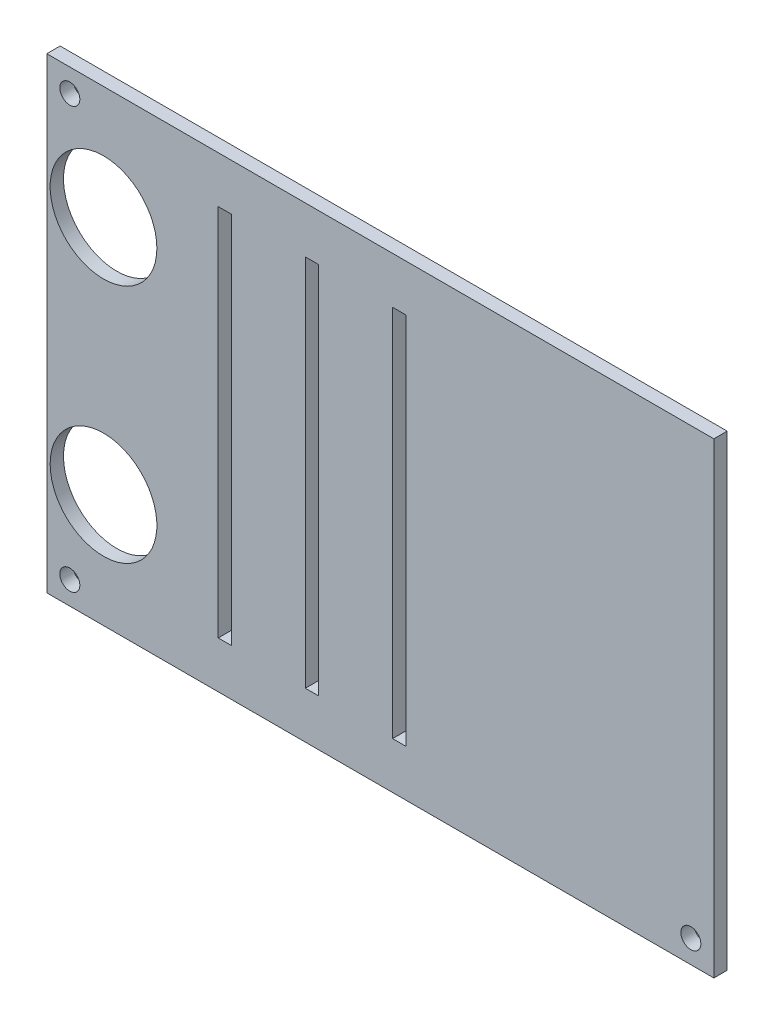
ISO-10303-21;
HEADER;
FILE_DESCRIPTION(('STEP AP214'),'2;1');
FILE_NAME('part.step','',(''),(''),'','','');
FILE_SCHEMA(('AUTOMOTIVE_DESIGN { 1 0 10303 214 1 1 1 1 }'));
ENDSEC;
DATA;
#1=APPLICATION_CONTEXT('core data for automotive mechanical design processes');
#2=APPLICATION_PROTOCOL_DEFINITION('international standard','automotive_design',2000,#1);
#3=PRODUCT_CONTEXT('',#1,'mechanical');
#4=PRODUCT('Part','Part','',(#3));
#5=PRODUCT_RELATED_PRODUCT_CATEGORY('part','',(#4));
#6=PRODUCT_DEFINITION_FORMATION('','',#4);
#7=PRODUCT_DEFINITION_CONTEXT('part definition',#1,'design');
#8=PRODUCT_DEFINITION('design','',#6,#7);
#9=PRODUCT_DEFINITION_SHAPE('','',#8);
#10=(LENGTH_UNIT() NAMED_UNIT(*) SI_UNIT(.MILLI.,.METRE.));
#11=(NAMED_UNIT(*) PLANE_ANGLE_UNIT() SI_UNIT($,.RADIAN.));
#12=(NAMED_UNIT(*) SI_UNIT($,.STERADIAN.) SOLID_ANGLE_UNIT());
#13=UNCERTAINTY_MEASURE_WITH_UNIT(LENGTH_MEASURE(1.E-05),#10,'distance_accuracy_value','');
#14=(GEOMETRIC_REPRESENTATION_CONTEXT(3) GLOBAL_UNCERTAINTY_ASSIGNED_CONTEXT((#13)) GLOBAL_UNIT_ASSIGNED_CONTEXT((#10,
#11,#12)) REPRESENTATION_CONTEXT('',''));
#15=CARTESIAN_POINT('',(0.,0.,0.));
#16=DIRECTION('',(0.,0.,1.));
#17=DIRECTION('',(1.,0.,0.));
#18=AXIS2_PLACEMENT_3D('',#15,#16,#17);
#19=CARTESIAN_POINT('',(0.,0.,2.));
#20=DIRECTION('',(0.,0.,1.));
#21=DIRECTION('',(1.,0.,0.));
#22=AXIS2_PLACEMENT_3D('',#19,#20,#21);
#23=PLANE('',#22);
#24=CARTESIAN_POINT('',(8.5,-17.,2.));
#25=DIRECTION('',(0.,0.,1.));
#26=DIRECTION('',(1.,0.,0.));
#27=AXIS2_PLACEMENT_3D('',#24,#25,#26);
#28=CIRCLE('',#27,8.);
#29=CARTESIAN_POINT('',(16.5,-17.,2.));
#30=VERTEX_POINT('',#29);
#31=EDGE_CURVE('E305',#30,#30,#28,.T.);
#32=ORIENTED_EDGE('',*,*,#31,.F.);
#33=EDGE_LOOP('',(#32));
#34=FACE_BOUND('',#33,.T.);
#35=CARTESIAN_POINT('',(3.45,-66.55,2.));
#36=DIRECTION('',(0.,0.,1.));
#37=DIRECTION('',(-1.,0.,0.));
#38=AXIS2_PLACEMENT_3D('',#35,#36,#37);
#39=CIRCLE('',#38,1.5);
#40=CARTESIAN_POINT('',(1.95,-66.55,2.));
#41=VERTEX_POINT('',#40);
#42=EDGE_CURVE('E321',#41,#41,#39,.T.);
#43=ORIENTED_EDGE('',*,*,#42,.F.);
#44=EDGE_LOOP('',(#43));
#45=FACE_BOUND('',#44,.T.);
#46=DIRECTION('',(0.,-1.,0.));
#47=VECTOR('',#46,1.);
#48=CARTESIAN_POINT('',(0.,0.,2.));
#49=LINE('',#48,#47);
#50=CARTESIAN_POINT('',(0.,0.,2.));
#51=VERTEX_POINT('',#50);
#52=CARTESIAN_POINT('',(0.,-70.,2.));
#53=VERTEX_POINT('',#52);
#54=EDGE_CURVE('E337',#51,#53,#49,.T.);
#55=ORIENTED_EDGE('',*,*,#54,.T.);
#56=DIRECTION('',(1.,0.,0.));
#57=VECTOR('',#56,1.);
#58=CARTESIAN_POINT('',(0.,-70.,2.));
#59=LINE('',#58,#57);
#60=CARTESIAN_POINT('',(100.,-70.,2.));
#61=VERTEX_POINT('',#60);
#62=EDGE_CURVE('E341',#53,#61,#59,.T.);
#63=ORIENTED_EDGE('',*,*,#62,.T.);
#64=DIRECTION('',(0.,1.,0.));
#65=VECTOR('',#64,1.);
#66=CARTESIAN_POINT('',(100.,0.,2.));
#67=LINE('',#66,#65);
#68=CARTESIAN_POINT('',(100.,0.,2.));
#69=VERTEX_POINT('',#68);
#70=EDGE_CURVE('E345',#61,#69,#67,.T.);
#71=ORIENTED_EDGE('',*,*,#70,.T.);
#72=DIRECTION('',(-1.,0.,0.));
#73=VECTOR('',#72,1.);
#74=CARTESIAN_POINT('',(0.,0.,2.));
#75=LINE('',#74,#73);
#76=EDGE_CURVE('E348',#69,#51,#75,.T.);
#77=ORIENTED_EDGE('',*,*,#76,.T.);
#78=EDGE_LOOP('',(#55,#63,#71,#77));
#79=FACE_BOUND('',#78,.T.);
#80=CARTESIAN_POINT('',(3.45,-3.45,2.));
#81=DIRECTION('',(0.,0.,1.));
#82=DIRECTION('',(1.,0.,0.));
#83=AXIS2_PLACEMENT_3D('',#80,#81,#82);
#84=CIRCLE('',#83,1.5);
#85=CARTESIAN_POINT('',(4.95,-3.45,2.));
#86=VERTEX_POINT('',#85);
#87=EDGE_CURVE('E329',#86,#86,#84,.T.);
#88=ORIENTED_EDGE('',*,*,#87,.F.);
#89=EDGE_LOOP('',(#88));
#90=FACE_BOUND('',#89,.T.);
#91=CARTESIAN_POINT('',(96.55,-66.55,2.));
#92=DIRECTION('',(0.,0.,1.));
#93=DIRECTION('',(1.,0.,0.));
#94=AXIS2_PLACEMENT_3D('',#91,#92,#93);
#95=CIRCLE('',#94,1.49999999999998);
#96=CARTESIAN_POINT('',(98.05,-66.55,2.));
#97=VERTEX_POINT('',#96);
#98=EDGE_CURVE('E313',#97,#97,#95,.T.);
#99=ORIENTED_EDGE('',*,*,#98,.F.);
#100=EDGE_LOOP('',(#99));
#101=FACE_BOUND('',#100,.T.);
#102=CARTESIAN_POINT('',(8.5,-53.,2.));
#103=DIRECTION('',(0.,0.,1.));
#104=DIRECTION('',(-1.,0.,0.));
#105=AXIS2_PLACEMENT_3D('',#102,#103,#104);
#106=CIRCLE('',#105,8.);
#107=CARTESIAN_POINT('',(0.500000000000002,-53.,2.));
#108=VERTEX_POINT('',#107);
#109=EDGE_CURVE('E297',#108,#108,#106,.T.);
#110=ORIENTED_EDGE('',*,*,#109,.F.);
#111=EDGE_LOOP('',(#110));
#112=FACE_BOUND('',#111,.T.);
#113=DIRECTION('',(-1.,0.,0.));
#114=VECTOR('',#113,1.);
#115=CARTESIAN_POINT('',(38.76,-6.99999999999996,2.));
#116=LINE('',#115,#114);
#117=CARTESIAN_POINT('',(40.76,-6.99999999999996,2.));
#118=VERTEX_POINT('',#117);
#119=CARTESIAN_POINT('',(38.76,-6.99999999999996,2.));
#120=VERTEX_POINT('',#119);
#121=EDGE_CURVE('E257',#118,#120,#116,.T.);
#122=ORIENTED_EDGE('',*,*,#121,.F.);
#123=DIRECTION('',(0.,1.,0.));
#124=VECTOR('',#123,1.);
#125=CARTESIAN_POINT('',(40.76,-63.,2.));
#126=LINE('',#125,#124);
#127=CARTESIAN_POINT('',(40.76,-63.,2.));
#128=VERTEX_POINT('',#127);
#129=EDGE_CURVE('E254',#128,#118,#126,.T.);
#130=ORIENTED_EDGE('',*,*,#129,.F.);
#131=DIRECTION('',(1.,0.,0.));
#132=VECTOR('',#131,1.);
#133=CARTESIAN_POINT('',(38.76,-63.,2.));
#134=LINE('',#133,#132);
#135=CARTESIAN_POINT('',(38.76,-63.,2.));
#136=VERTEX_POINT('',#135);
#137=EDGE_CURVE('E265',#136,#128,#134,.T.);
#138=ORIENTED_EDGE('',*,*,#137,.F.);
#139=DIRECTION('',(0.,-1.,0.));
#140=VECTOR('',#139,1.);
#141=CARTESIAN_POINT('',(38.76,-63.,2.));
#142=LINE('',#141,#140);
#143=EDGE_CURVE('E261',#120,#136,#142,.T.);
#144=ORIENTED_EDGE('',*,*,#143,.F.);
#145=EDGE_LOOP('',(#122,#130,#138,#144));
#146=FACE_BOUND('',#145,.T.);
#147=DIRECTION('',(-1.,0.,0.));
#148=VECTOR('',#147,1.);
#149=CARTESIAN_POINT('',(51.84,-6.99999999999999,2.));
#150=LINE('',#149,#148);
#151=CARTESIAN_POINT('',(53.84,-6.99999999999999,2.));
#152=VERTEX_POINT('',#151);
#153=CARTESIAN_POINT('',(51.84,-6.99999999999999,2.));
#154=VERTEX_POINT('',#153);
#155=EDGE_CURVE('E214',#152,#154,#150,.T.);
#156=ORIENTED_EDGE('',*,*,#155,.F.);
#157=DIRECTION('',(0.,1.,0.));
#158=VECTOR('',#157,1.);
#159=CARTESIAN_POINT('',(53.84,-63.,2.));
#160=LINE('',#159,#158);
#161=CARTESIAN_POINT('',(53.84,-63.,2.));
#162=VERTEX_POINT('',#161);
#163=EDGE_CURVE('E211',#162,#152,#160,.T.);
#164=ORIENTED_EDGE('',*,*,#163,.F.);
#165=DIRECTION('',(1.,0.,0.));
#166=VECTOR('',#165,1.);
#167=CARTESIAN_POINT('',(51.84,-63.,2.));
#168=LINE('',#167,#166);
#169=CARTESIAN_POINT('',(51.84,-63.,2.));
#170=VERTEX_POINT('',#169);
#171=EDGE_CURVE('E222',#170,#162,#168,.T.);
#172=ORIENTED_EDGE('',*,*,#171,.F.);
#173=DIRECTION('',(0.,-1.,0.));
#174=VECTOR('',#173,1.);
#175=CARTESIAN_POINT('',(51.84,-63.,2.));
#176=LINE('',#175,#174);
#177=EDGE_CURVE('E218',#154,#170,#176,.T.);
#178=ORIENTED_EDGE('',*,*,#177,.F.);
#179=EDGE_LOOP('',(#156,#164,#172,#178));
#180=FACE_BOUND('',#179,.T.);
#181=DIRECTION('',(0.,-1.,0.));
#182=VECTOR('',#181,1.);
#183=CARTESIAN_POINT('',(25.7,-63.0000000000001,2.));
#184=LINE('',#183,#182);
#185=CARTESIAN_POINT('',(25.7,-7.00000000000005,2.));
#186=VERTEX_POINT('',#185);
#187=CARTESIAN_POINT('',(25.7,-63.0000000000001,2.));
#188=VERTEX_POINT('',#187);
#189=EDGE_CURVE('E172',#186,#188,#184,.T.);
#190=ORIENTED_EDGE('',*,*,#189,.F.);
#191=DIRECTION('',(-1.,0.,0.));
#192=VECTOR('',#191,1.);
#193=CARTESIAN_POINT('',(25.7,-7.00000000000005,2.));
#194=LINE('',#193,#192);
#195=CARTESIAN_POINT('',(27.7,-7.00000000000005,2.));
#196=VERTEX_POINT('',#195);
#197=EDGE_CURVE('E163',#196,#186,#194,.T.);
#198=ORIENTED_EDGE('',*,*,#197,.F.);
#199=DIRECTION('',(0.,1.,0.));
#200=VECTOR('',#199,1.);
#201=CARTESIAN_POINT('',(27.7,-63.0000000000001,2.));
#202=LINE('',#201,#200);
#203=CARTESIAN_POINT('',(27.7,-63.0000000000001,2.));
#204=VERTEX_POINT('',#203);
#205=EDGE_CURVE('E189',#204,#196,#202,.T.);
#206=ORIENTED_EDGE('',*,*,#205,.F.);
#207=DIRECTION('',(1.,0.,0.));
#208=VECTOR('',#207,1.);
#209=CARTESIAN_POINT('',(25.7,-63.0000000000001,2.));
#210=LINE('',#209,#208);
#211=EDGE_CURVE('E185',#188,#204,#210,.T.);
#212=ORIENTED_EDGE('',*,*,#211,.F.);
#213=EDGE_LOOP('',(#190,#198,#206,#212));
#214=FACE_BOUND('',#213,.T.);
#215=ADVANCED_FACE('F49',(#34,#45,#79,#90,#101,#112,#146,#180,#214),#23,.T.);
#216=CARTESIAN_POINT('',(0.,0.,0.));
#217=DIRECTION('',(0.,0.,1.));
#218=DIRECTION('',(1.,0.,0.));
#219=AXIS2_PLACEMENT_3D('',#216,#217,#218);
#220=PLANE('',#219);
#221=DIRECTION('',(0.,1.,0.));
#222=VECTOR('',#221,1.);
#223=CARTESIAN_POINT('',(53.84,-63.,0.));
#224=LINE('',#223,#222);
#225=CARTESIAN_POINT('',(53.84,-63.,0.));
#226=VERTEX_POINT('',#225);
#227=CARTESIAN_POINT('',(53.84,-6.99999999999999,0.));
#228=VERTEX_POINT('',#227);
#229=EDGE_CURVE('E181',#226,#228,#224,.T.);
#230=ORIENTED_EDGE('',*,*,#229,.T.);
#231=DIRECTION('',(-1.,0.,0.));
#232=VECTOR('',#231,1.);
#233=CARTESIAN_POINT('',(51.84,-6.99999999999999,0.));
#234=LINE('',#233,#232);
#235=CARTESIAN_POINT('',(51.84,-6.99999999999999,0.));
#236=VERTEX_POINT('',#235);
#237=EDGE_CURVE('E229',#228,#236,#234,.T.);
#238=ORIENTED_EDGE('',*,*,#237,.T.);
#239=DIRECTION('',(0.,-1.,0.));
#240=VECTOR('',#239,1.);
#241=CARTESIAN_POINT('',(51.84,-63.,0.));
#242=LINE('',#241,#240);
#243=CARTESIAN_POINT('',(51.84,-63.,0.));
#244=VERTEX_POINT('',#243);
#245=EDGE_CURVE('E233',#236,#244,#242,.T.);
#246=ORIENTED_EDGE('',*,*,#245,.T.);
#247=DIRECTION('',(1.,0.,0.));
#248=VECTOR('',#247,1.);
#249=CARTESIAN_POINT('',(51.84,-63.,0.));
#250=LINE('',#249,#248);
#251=EDGE_CURVE('E215',#244,#226,#250,.T.);
#252=ORIENTED_EDGE('',*,*,#251,.T.);
#253=EDGE_LOOP('',(#230,#238,#246,#252));
#254=FACE_BOUND('',#253,.T.);
#255=CARTESIAN_POINT('',(8.5,-53.,0.));
#256=DIRECTION('',(0.,0.,1.));
#257=DIRECTION('',(-1.,0.,0.));
#258=AXIS2_PLACEMENT_3D('',#255,#256,#257);
#259=CIRCLE('',#258,8.);
#260=CARTESIAN_POINT('',(0.500000000000002,-53.,0.));
#261=VERTEX_POINT('',#260);
#262=EDGE_CURVE('E296',#261,#261,#259,.T.);
#263=ORIENTED_EDGE('',*,*,#262,.T.);
#264=EDGE_LOOP('',(#263));
#265=FACE_BOUND('',#264,.T.);
#266=CARTESIAN_POINT('',(8.5,-17.,0.));
#267=DIRECTION('',(0.,0.,1.));
#268=DIRECTION('',(1.,0.,0.));
#269=AXIS2_PLACEMENT_3D('',#266,#267,#268);
#270=CIRCLE('',#269,8.);
#271=CARTESIAN_POINT('',(16.5,-17.,0.));
#272=VERTEX_POINT('',#271);
#273=EDGE_CURVE('E301',#272,#272,#270,.T.);
#274=ORIENTED_EDGE('',*,*,#273,.T.);
#275=EDGE_LOOP('',(#274));
#276=FACE_BOUND('',#275,.T.);
#277=CARTESIAN_POINT('',(96.55,-66.55,0.));
#278=DIRECTION('',(0.,0.,1.));
#279=DIRECTION('',(1.,0.,0.));
#280=AXIS2_PLACEMENT_3D('',#277,#278,#279);
#281=CIRCLE('',#280,1.49999999999998);
#282=CARTESIAN_POINT('',(98.05,-66.55,0.));
#283=VERTEX_POINT('',#282);
#284=EDGE_CURVE('E309',#283,#283,#281,.T.);
#285=ORIENTED_EDGE('',*,*,#284,.T.);
#286=EDGE_LOOP('',(#285));
#287=FACE_BOUND('',#286,.T.);
#288=CARTESIAN_POINT('',(3.45,-66.55,0.));
#289=DIRECTION('',(0.,0.,1.));
#290=DIRECTION('',(-1.,0.,0.));
#291=AXIS2_PLACEMENT_3D('',#288,#289,#290);
#292=CIRCLE('',#291,1.5);
#293=CARTESIAN_POINT('',(1.95,-66.55,0.));
#294=VERTEX_POINT('',#293);
#295=EDGE_CURVE('E317',#294,#294,#292,.T.);
#296=ORIENTED_EDGE('',*,*,#295,.T.);
#297=EDGE_LOOP('',(#296));
#298=FACE_BOUND('',#297,.T.);
#299=CARTESIAN_POINT('',(3.45,-3.45,0.));
#300=DIRECTION('',(0.,0.,1.));
#301=DIRECTION('',(1.,0.,0.));
#302=AXIS2_PLACEMENT_3D('',#299,#300,#301);
#303=CIRCLE('',#302,1.5);
#304=CARTESIAN_POINT('',(4.95,-3.45,0.));
#305=VERTEX_POINT('',#304);
#306=EDGE_CURVE('E325',#305,#305,#303,.T.);
#307=ORIENTED_EDGE('',*,*,#306,.T.);
#308=EDGE_LOOP('',(#307));
#309=FACE_BOUND('',#308,.T.);
#310=DIRECTION('',(0.,-1.,0.));
#311=VECTOR('',#310,1.);
#312=CARTESIAN_POINT('',(0.,0.,0.));
#313=LINE('',#312,#311);
#314=CARTESIAN_POINT('',(0.,0.,0.));
#315=VERTEX_POINT('',#314);
#316=CARTESIAN_POINT('',(0.,-70.,0.));
#317=VERTEX_POINT('',#316);
#318=EDGE_CURVE('E333',#315,#317,#313,.T.);
#319=ORIENTED_EDGE('',*,*,#318,.F.);
#320=DIRECTION('',(-1.,0.,0.));
#321=VECTOR('',#320,1.);
#322=CARTESIAN_POINT('',(0.,0.,0.));
#323=LINE('',#322,#321);
#324=CARTESIAN_POINT('',(100.,0.,0.));
#325=VERTEX_POINT('',#324);
#326=EDGE_CURVE('E342',#325,#315,#323,.T.);
#327=ORIENTED_EDGE('',*,*,#326,.F.);
#328=DIRECTION('',(0.,1.,0.));
#329=VECTOR('',#328,1.);
#330=CARTESIAN_POINT('',(100.,0.,0.));
#331=LINE('',#330,#329);
#332=CARTESIAN_POINT('',(100.,-70.,0.));
#333=VERTEX_POINT('',#332);
#334=EDGE_CURVE('E358',#333,#325,#331,.T.);
#335=ORIENTED_EDGE('',*,*,#334,.F.);
#336=DIRECTION('',(1.,0.,0.));
#337=VECTOR('',#336,1.);
#338=CARTESIAN_POINT('',(0.,-70.,0.));
#339=LINE('',#338,#337);
#340=EDGE_CURVE('E355',#317,#333,#339,.T.);
#341=ORIENTED_EDGE('',*,*,#340,.F.);
#342=EDGE_LOOP('',(#319,#327,#335,#341));
#343=FACE_BOUND('',#342,.T.);
#344=DIRECTION('',(0.,1.,0.));
#345=VECTOR('',#344,1.);
#346=CARTESIAN_POINT('',(40.76,-63.,0.));
#347=LINE('',#346,#345);
#348=CARTESIAN_POINT('',(40.76,-63.,0.));
#349=VERTEX_POINT('',#348);
#350=CARTESIAN_POINT('',(40.76,-6.99999999999996,0.));
#351=VERTEX_POINT('',#350);
#352=EDGE_CURVE('E253',#349,#351,#347,.T.);
#353=ORIENTED_EDGE('',*,*,#352,.T.);
#354=DIRECTION('',(-1.,0.,0.));
#355=VECTOR('',#354,1.);
#356=CARTESIAN_POINT('',(38.76,-6.99999999999996,0.));
#357=LINE('',#356,#355);
#358=CARTESIAN_POINT('',(38.76,-6.99999999999996,0.));
#359=VERTEX_POINT('',#358);
#360=EDGE_CURVE('E272',#351,#359,#357,.T.);
#361=ORIENTED_EDGE('',*,*,#360,.T.);
#362=DIRECTION('',(0.,-1.,0.));
#363=VECTOR('',#362,1.);
#364=CARTESIAN_POINT('',(38.76,-63.,0.));
#365=LINE('',#364,#363);
#366=CARTESIAN_POINT('',(38.76,-63.,0.));
#367=VERTEX_POINT('',#366);
#368=EDGE_CURVE('E276',#359,#367,#365,.T.);
#369=ORIENTED_EDGE('',*,*,#368,.T.);
#370=DIRECTION('',(1.,0.,0.));
#371=VECTOR('',#370,1.);
#372=CARTESIAN_POINT('',(38.76,-63.,0.));
#373=LINE('',#372,#371);
#374=EDGE_CURVE('E258',#367,#349,#373,.T.);
#375=ORIENTED_EDGE('',*,*,#374,.T.);
#376=EDGE_LOOP('',(#353,#361,#369,#375));
#377=FACE_BOUND('',#376,.T.);
#378=DIRECTION('',(-1.,0.,0.));
#379=VECTOR('',#378,1.);
#380=CARTESIAN_POINT('',(25.7,-7.00000000000005,0.));
#381=LINE('',#380,#379);
#382=CARTESIAN_POINT('',(27.7,-7.00000000000005,0.));
#383=VERTEX_POINT('',#382);
#384=CARTESIAN_POINT('',(25.7,-7.00000000000005,0.));
#385=VERTEX_POINT('',#384);
#386=EDGE_CURVE('E73',#383,#385,#381,.T.);
#387=ORIENTED_EDGE('',*,*,#386,.T.);
#388=DIRECTION('',(0.,-1.,0.));
#389=VECTOR('',#388,1.);
#390=CARTESIAN_POINT('',(25.7,-63.0000000000001,0.));
#391=LINE('',#390,#389);
#392=CARTESIAN_POINT('',(25.7,-63.0000000000001,0.));
#393=VERTEX_POINT('',#392);
#394=EDGE_CURVE('E179',#385,#393,#391,.T.);
#395=ORIENTED_EDGE('',*,*,#394,.T.);
#396=DIRECTION('',(1.,0.,0.));
#397=VECTOR('',#396,1.);
#398=CARTESIAN_POINT('',(25.7,-63.0000000000001,0.));
#399=LINE('',#398,#397);
#400=CARTESIAN_POINT('',(27.7,-63.0000000000001,0.));
#401=VERTEX_POINT('',#400);
#402=EDGE_CURVE('E198',#393,#401,#399,.T.);
#403=ORIENTED_EDGE('',*,*,#402,.T.);
#404=DIRECTION('',(0.,1.,0.));
#405=VECTOR('',#404,1.);
#406=CARTESIAN_POINT('',(27.7,-63.0000000000001,0.));
#407=LINE('',#406,#405);
#408=EDGE_CURVE('E173',#401,#383,#407,.T.);
#409=ORIENTED_EDGE('',*,*,#408,.T.);
#410=EDGE_LOOP('',(#387,#395,#403,#409));
#411=FACE_BOUND('',#410,.T.);
#412=ADVANCED_FACE('F381',(#254,#265,#276,#287,#298,#309,#343,#377,#411),#220,.F.);
#413=CARTESIAN_POINT('',(0.,0.,2.));
#414=DIRECTION('',(1.,0.,0.));
#415=DIRECTION('',(0.,1.,0.));
#416=AXIS2_PLACEMENT_3D('',#413,#414,#415);
#417=PLANE('',#416);
#418=ORIENTED_EDGE('',*,*,#318,.T.);
#419=DIRECTION('',(0.,0.,-1.));
#420=VECTOR('',#419,1.);
#421=CARTESIAN_POINT('',(0.,-70.,2.));
#422=LINE('',#421,#420);
#423=EDGE_CURVE('E11',#53,#317,#422,.T.);
#424=ORIENTED_EDGE('',*,*,#423,.F.);
#425=ORIENTED_EDGE('',*,*,#54,.F.);
#426=DIRECTION('',(0.,0.,-1.));
#427=VECTOR('',#426,1.);
#428=CARTESIAN_POINT('',(0.,0.,2.));
#429=LINE('',#428,#427);
#430=EDGE_CURVE('E351',#51,#315,#429,.T.);
#431=ORIENTED_EDGE('',*,*,#430,.T.);
#432=EDGE_LOOP('',(#418,#424,#425,#431));
#433=FACE_BOUND('',#432,.T.);
#434=ADVANCED_FACE('F51',(#433),#417,.F.);
#435=CARTESIAN_POINT('',(0.,-70.,2.));
#436=DIRECTION('',(0.,1.,0.));
#437=DIRECTION('',(0.,0.,1.));
#438=AXIS2_PLACEMENT_3D('',#435,#436,#437);
#439=PLANE('',#438);
#440=ORIENTED_EDGE('',*,*,#340,.T.);
#441=DIRECTION('',(0.,0.,-1.));
#442=VECTOR('',#441,1.);
#443=CARTESIAN_POINT('',(100.,-70.,2.));
#444=LINE('',#443,#442);
#445=EDGE_CURVE('E58',#61,#333,#444,.T.);
#446=ORIENTED_EDGE('',*,*,#445,.F.);
#447=ORIENTED_EDGE('',*,*,#62,.F.);
#448=ORIENTED_EDGE('',*,*,#423,.T.);
#449=EDGE_LOOP('',(#440,#446,#447,#448));
#450=FACE_BOUND('',#449,.T.);
#451=ADVANCED_FACE('F392',(#450),#439,.F.);
#452=CARTESIAN_POINT('',(100.,0.,2.));
#453=DIRECTION('',(-1.,0.,0.));
#454=DIRECTION('',(0.,-1.,0.));
#455=AXIS2_PLACEMENT_3D('',#452,#453,#454);
#456=PLANE('',#455);
#457=ORIENTED_EDGE('',*,*,#334,.T.);
#458=DIRECTION('',(0.,0.,-1.));
#459=VECTOR('',#458,1.);
#460=CARTESIAN_POINT('',(100.,0.,2.));
#461=LINE('',#460,#459);
#462=EDGE_CURVE('E366',#69,#325,#461,.T.);
#463=ORIENTED_EDGE('',*,*,#462,.F.);
#464=ORIENTED_EDGE('',*,*,#70,.F.);
#465=ORIENTED_EDGE('',*,*,#445,.T.);
#466=EDGE_LOOP('',(#457,#463,#464,#465));
#467=FACE_BOUND('',#466,.T.);
#468=ADVANCED_FACE('F375',(#467),#456,.F.);
#469=CARTESIAN_POINT('',(0.,0.,2.));
#470=DIRECTION('',(0.,-1.,0.));
#471=DIRECTION('',(0.,0.,-1.));
#472=AXIS2_PLACEMENT_3D('',#469,#470,#471);
#473=PLANE('',#472);
#474=ORIENTED_EDGE('',*,*,#326,.T.);
#475=ORIENTED_EDGE('',*,*,#430,.F.);
#476=ORIENTED_EDGE('',*,*,#76,.F.);
#477=ORIENTED_EDGE('',*,*,#462,.T.);
#478=EDGE_LOOP('',(#474,#475,#476,#477));
#479=FACE_BOUND('',#478,.T.);
#480=ADVANCED_FACE('F385',(#479),#473,.F.);
#481=CARTESIAN_POINT('',(3.45,-3.45,2.));
#482=DIRECTION('',(0.,0.,-1.));
#483=DIRECTION('',(-1.,0.,0.));
#484=AXIS2_PLACEMENT_3D('',#481,#482,#483);
#485=CYLINDRICAL_SURFACE('',#484,1.5);
#486=ORIENTED_EDGE('',*,*,#87,.T.);
#487=EDGE_LOOP('',(#486));
#488=FACE_BOUND('',#487,.T.);
#489=ORIENTED_EDGE('',*,*,#306,.F.);
#490=EDGE_LOOP('',(#489));
#491=FACE_BOUND('',#490,.T.);
#492=ADVANCED_FACE('F410',(#488,#491),#485,.F.);
#493=CARTESIAN_POINT('',(3.45,-66.55,2.));
#494=DIRECTION('',(0.,0.,-1.));
#495=DIRECTION('',(-1.,0.,0.));
#496=AXIS2_PLACEMENT_3D('',#493,#494,#495);
#497=CYLINDRICAL_SURFACE('',#496,1.5);
#498=ORIENTED_EDGE('',*,*,#42,.T.);
#499=EDGE_LOOP('',(#498));
#500=FACE_BOUND('',#499,.T.);
#501=ORIENTED_EDGE('',*,*,#295,.F.);
#502=EDGE_LOOP('',(#501));
#503=FACE_BOUND('',#502,.T.);
#504=ADVANCED_FACE('F417',(#500,#503),#497,.F.);
#505=CARTESIAN_POINT('',(96.55,-66.55,2.));
#506=DIRECTION('',(0.,0.,-1.));
#507=DIRECTION('',(-1.,0.,0.));
#508=AXIS2_PLACEMENT_3D('',#505,#506,#507);
#509=CYLINDRICAL_SURFACE('',#508,1.49999999999998);
#510=ORIENTED_EDGE('',*,*,#98,.T.);
#511=EDGE_LOOP('',(#510));
#512=FACE_BOUND('',#511,.T.);
#513=ORIENTED_EDGE('',*,*,#284,.F.);
#514=EDGE_LOOP('',(#513));
#515=FACE_BOUND('',#514,.T.);
#516=ADVANCED_FACE('F422',(#512,#515),#509,.F.);
#517=CARTESIAN_POINT('',(8.5,-17.,2.));
#518=DIRECTION('',(0.,0.,-1.));
#519=DIRECTION('',(-1.,0.,0.));
#520=AXIS2_PLACEMENT_3D('',#517,#518,#519);
#521=CYLINDRICAL_SURFACE('',#520,8.);
#522=ORIENTED_EDGE('',*,*,#31,.T.);
#523=EDGE_LOOP('',(#522));
#524=FACE_BOUND('',#523,.T.);
#525=ORIENTED_EDGE('',*,*,#273,.F.);
#526=EDGE_LOOP('',(#525));
#527=FACE_BOUND('',#526,.T.);
#528=ADVANCED_FACE('F488',(#524,#527),#521,.F.);
#529=CARTESIAN_POINT('',(8.5,-53.,2.));
#530=DIRECTION('',(0.,0.,-1.));
#531=DIRECTION('',(-1.,0.,0.));
#532=AXIS2_PLACEMENT_3D('',#529,#530,#531);
#533=CYLINDRICAL_SURFACE('',#532,8.);
#534=ORIENTED_EDGE('',*,*,#109,.T.);
#535=EDGE_LOOP('',(#534));
#536=FACE_BOUND('',#535,.T.);
#537=ORIENTED_EDGE('',*,*,#262,.F.);
#538=EDGE_LOOP('',(#537));
#539=FACE_BOUND('',#538,.T.);
#540=ADVANCED_FACE('F484',(#536,#539),#533,.F.);
#541=CARTESIAN_POINT('',(40.76,-63.,2.));
#542=DIRECTION('',(-1.,0.,0.));
#543=DIRECTION('',(0.,-1.,0.));
#544=AXIS2_PLACEMENT_3D('',#541,#542,#543);
#545=PLANE('',#544);
#546=ORIENTED_EDGE('',*,*,#352,.F.);
#547=DIRECTION('',(0.,0.,-1.));
#548=VECTOR('',#547,1.);
#549=CARTESIAN_POINT('',(40.76,-63.,2.));
#550=LINE('',#549,#548);
#551=EDGE_CURVE('E268',#128,#349,#550,.T.);
#552=ORIENTED_EDGE('',*,*,#551,.F.);
#553=ORIENTED_EDGE('',*,*,#129,.T.);
#554=DIRECTION('',(0.,0.,-1.));
#555=VECTOR('',#554,1.);
#556=CARTESIAN_POINT('',(40.76,-6.99999999999996,2.));
#557=LINE('',#556,#555);
#558=EDGE_CURVE('E292',#118,#351,#557,.T.);
#559=ORIENTED_EDGE('',*,*,#558,.T.);
#560=EDGE_LOOP('',(#546,#552,#553,#559));
#561=FACE_BOUND('',#560,.T.);
#562=ADVANCED_FACE('F480',(#561),#545,.T.);
#563=CARTESIAN_POINT('',(38.76,-6.99999999999996,2.));
#564=DIRECTION('',(0.,-1.,0.));
#565=DIRECTION('',(1.,0.,0.));
#566=AXIS2_PLACEMENT_3D('',#563,#564,#565);
#567=PLANE('',#566);
#568=ORIENTED_EDGE('',*,*,#360,.F.);
#569=ORIENTED_EDGE('',*,*,#558,.F.);
#570=ORIENTED_EDGE('',*,*,#121,.T.);
#571=DIRECTION('',(0.,0.,-1.));
#572=VECTOR('',#571,1.);
#573=CARTESIAN_POINT('',(38.76,-6.99999999999996,2.));
#574=LINE('',#573,#572);
#575=EDGE_CURVE('E289',#120,#359,#574,.T.);
#576=ORIENTED_EDGE('',*,*,#575,.T.);
#577=EDGE_LOOP('',(#568,#569,#570,#576));
#578=FACE_BOUND('',#577,.T.);
#579=ADVANCED_FACE('F476',(#578),#567,.T.);
#580=CARTESIAN_POINT('',(38.76,-63.,2.));
#581=DIRECTION('',(1.,0.,0.));
#582=DIRECTION('',(0.,1.,0.));
#583=AXIS2_PLACEMENT_3D('',#580,#581,#582);
#584=PLANE('',#583);
#585=ORIENTED_EDGE('',*,*,#368,.F.);
#586=ORIENTED_EDGE('',*,*,#575,.F.);
#587=ORIENTED_EDGE('',*,*,#143,.T.);
#588=DIRECTION('',(0.,0.,-1.));
#589=VECTOR('',#588,1.);
#590=CARTESIAN_POINT('',(38.76,-63.,2.));
#591=LINE('',#590,#589);
#592=EDGE_CURVE('E286',#136,#367,#591,.T.);
#593=ORIENTED_EDGE('',*,*,#592,.T.);
#594=EDGE_LOOP('',(#585,#586,#587,#593));
#595=FACE_BOUND('',#594,.T.);
#596=ADVANCED_FACE('F472',(#595),#584,.T.);
#597=CARTESIAN_POINT('',(38.76,-63.,2.));
#598=DIRECTION('',(0.,1.,0.));
#599=DIRECTION('',(-1.,0.,0.));
#600=AXIS2_PLACEMENT_3D('',#597,#598,#599);
#601=PLANE('',#600);
#602=ORIENTED_EDGE('',*,*,#374,.F.);
#603=ORIENTED_EDGE('',*,*,#592,.F.);
#604=ORIENTED_EDGE('',*,*,#137,.T.);
#605=ORIENTED_EDGE('',*,*,#551,.T.);
#606=EDGE_LOOP('',(#602,#603,#604,#605));
#607=FACE_BOUND('',#606,.T.);
#608=ADVANCED_FACE('F469',(#607),#601,.T.);
#609=CARTESIAN_POINT('',(53.84,-63.,2.));
#610=DIRECTION('',(-1.,0.,0.));
#611=DIRECTION('',(0.,-1.,0.));
#612=AXIS2_PLACEMENT_3D('',#609,#610,#611);
#613=PLANE('',#612);
#614=ORIENTED_EDGE('',*,*,#229,.F.);
#615=DIRECTION('',(0.,0.,-1.));
#616=VECTOR('',#615,1.);
#617=CARTESIAN_POINT('',(53.84,-63.,2.));
#618=LINE('',#617,#616);
#619=EDGE_CURVE('E225',#162,#226,#618,.T.);
#620=ORIENTED_EDGE('',*,*,#619,.F.);
#621=ORIENTED_EDGE('',*,*,#163,.T.);
#622=DIRECTION('',(0.,0.,-1.));
#623=VECTOR('',#622,1.);
#624=CARTESIAN_POINT('',(53.84,-6.99999999999999,2.));
#625=LINE('',#624,#623);
#626=EDGE_CURVE('E249',#152,#228,#625,.T.);
#627=ORIENTED_EDGE('',*,*,#626,.T.);
#628=EDGE_LOOP('',(#614,#620,#621,#627));
#629=FACE_BOUND('',#628,.T.);
#630=ADVANCED_FACE('F451',(#629),#613,.T.);
#631=CARTESIAN_POINT('',(51.84,-6.99999999999999,2.));
#632=DIRECTION('',(0.,-1.,0.));
#633=DIRECTION('',(1.,0.,0.));
#634=AXIS2_PLACEMENT_3D('',#631,#632,#633);
#635=PLANE('',#634);
#636=ORIENTED_EDGE('',*,*,#237,.F.);
#637=ORIENTED_EDGE('',*,*,#626,.F.);
#638=ORIENTED_EDGE('',*,*,#155,.T.);
#639=DIRECTION('',(0.,0.,-1.));
#640=VECTOR('',#639,1.);
#641=CARTESIAN_POINT('',(51.84,-6.99999999999999,2.));
#642=LINE('',#641,#640);
#643=EDGE_CURVE('E246',#154,#236,#642,.T.);
#644=ORIENTED_EDGE('',*,*,#643,.T.);
#645=EDGE_LOOP('',(#636,#637,#638,#644));
#646=FACE_BOUND('',#645,.T.);
#647=ADVANCED_FACE('F444',(#646),#635,.T.);
#648=CARTESIAN_POINT('',(51.84,-63.,2.));
#649=DIRECTION('',(1.,0.,0.));
#650=DIRECTION('',(0.,1.,0.));
#651=AXIS2_PLACEMENT_3D('',#648,#649,#650);
#652=PLANE('',#651);
#653=ORIENTED_EDGE('',*,*,#245,.F.);
#654=ORIENTED_EDGE('',*,*,#643,.F.);
#655=ORIENTED_EDGE('',*,*,#177,.T.);
#656=DIRECTION('',(0.,0.,-1.));
#657=VECTOR('',#656,1.);
#658=CARTESIAN_POINT('',(51.84,-63.,2.));
#659=LINE('',#658,#657);
#660=EDGE_CURVE('E243',#170,#244,#659,.T.);
#661=ORIENTED_EDGE('',*,*,#660,.T.);
#662=EDGE_LOOP('',(#653,#654,#655,#661));
#663=FACE_BOUND('',#662,.T.);
#664=ADVANCED_FACE('F447',(#663),#652,.T.);
#665=CARTESIAN_POINT('',(51.84,-63.,2.));
#666=DIRECTION('',(0.,1.,0.));
#667=DIRECTION('',(0.,0.,1.));
#668=AXIS2_PLACEMENT_3D('',#665,#666,#667);
#669=PLANE('',#668);
#670=ORIENTED_EDGE('',*,*,#251,.F.);
#671=ORIENTED_EDGE('',*,*,#660,.F.);
#672=ORIENTED_EDGE('',*,*,#171,.T.);
#673=ORIENTED_EDGE('',*,*,#619,.T.);
#674=EDGE_LOOP('',(#670,#671,#672,#673));
#675=FACE_BOUND('',#674,.T.);
#676=ADVANCED_FACE('F454',(#675),#669,.T.);
#677=CARTESIAN_POINT('',(25.7,-7.00000000000005,2.));
#678=DIRECTION('',(0.,-1.,0.));
#679=DIRECTION('',(1.,0.,0.));
#680=AXIS2_PLACEMENT_3D('',#677,#678,#679);
#681=PLANE('',#680);
#682=ORIENTED_EDGE('',*,*,#386,.F.);
#683=DIRECTION('',(0.,0.,-1.));
#684=VECTOR('',#683,1.);
#685=CARTESIAN_POINT('',(27.7,-7.00000000000005,2.));
#686=LINE('',#685,#684);
#687=EDGE_CURVE('E167',#196,#383,#686,.T.);
#688=ORIENTED_EDGE('',*,*,#687,.F.);
#689=ORIENTED_EDGE('',*,*,#197,.T.);
#690=DIRECTION('',(0.,0.,-1.));
#691=VECTOR('',#690,1.);
#692=CARTESIAN_POINT('',(25.7,-7.00000000000005,2.));
#693=LINE('',#692,#691);
#694=EDGE_CURVE('E166',#186,#385,#693,.T.);
#695=ORIENTED_EDGE('',*,*,#694,.T.);
#696=EDGE_LOOP('',(#682,#688,#689,#695));
#697=FACE_BOUND('',#696,.T.);
#698=ADVANCED_FACE('F165',(#697),#681,.T.);
#699=CARTESIAN_POINT('',(25.7,-63.0000000000001,2.));
#700=DIRECTION('',(1.,0.,0.));
#701=DIRECTION('',(0.,1.,0.));
#702=AXIS2_PLACEMENT_3D('',#699,#700,#701);
#703=PLANE('',#702);
#704=ORIENTED_EDGE('',*,*,#394,.F.);
#705=ORIENTED_EDGE('',*,*,#694,.F.);
#706=ORIENTED_EDGE('',*,*,#189,.T.);
#707=DIRECTION('',(0.,0.,-1.));
#708=VECTOR('',#707,1.);
#709=CARTESIAN_POINT('',(25.7,-63.0000000000001,2.));
#710=LINE('',#709,#708);
#711=EDGE_CURVE('E182',#188,#393,#710,.T.);
#712=ORIENTED_EDGE('',*,*,#711,.T.);
#713=EDGE_LOOP('',(#704,#705,#706,#712));
#714=FACE_BOUND('',#713,.T.);
#715=ADVANCED_FACE('F176',(#714),#703,.T.);
#716=CARTESIAN_POINT('',(25.7,-63.0000000000001,2.));
#717=DIRECTION('',(0.,1.,0.));
#718=DIRECTION('',(-1.,0.,0.));
#719=AXIS2_PLACEMENT_3D('',#716,#717,#718);
#720=PLANE('',#719);
#721=ORIENTED_EDGE('',*,*,#402,.F.);
#722=ORIENTED_EDGE('',*,*,#711,.F.);
#723=ORIENTED_EDGE('',*,*,#211,.T.);
#724=DIRECTION('',(0.,0.,-1.));
#725=VECTOR('',#724,1.);
#726=CARTESIAN_POINT('',(27.7,-63.0000000000001,2.));
#727=LINE('',#726,#725);
#728=EDGE_CURVE('E65',#204,#401,#727,.T.);
#729=ORIENTED_EDGE('',*,*,#728,.T.);
#730=EDGE_LOOP('',(#721,#722,#723,#729));
#731=FACE_BOUND('',#730,.T.);
#732=ADVANCED_FACE('F560',(#731),#720,.T.);
#733=CARTESIAN_POINT('',(27.7,-63.0000000000001,2.));
#734=DIRECTION('',(-1.,0.,0.));
#735=DIRECTION('',(0.,-1.,0.));
#736=AXIS2_PLACEMENT_3D('',#733,#734,#735);
#737=PLANE('',#736);
#738=ORIENTED_EDGE('',*,*,#408,.F.);
#739=ORIENTED_EDGE('',*,*,#728,.F.);
#740=ORIENTED_EDGE('',*,*,#205,.T.);
#741=ORIENTED_EDGE('',*,*,#687,.T.);
#742=EDGE_LOOP('',(#738,#739,#740,#741));
#743=FACE_BOUND('',#742,.T.);
#744=ADVANCED_FACE('F568',(#743),#737,.T.);
#745=CLOSED_SHELL('',(#215,#412,#434,#451,#468,#480,#492,#504,#516,#528,#540,#562,#579,#596,
#608,#630,#647,#664,#676,#698,#715,#732,#744));
#746=MANIFOLD_SOLID_BREP('B2',#745);
#747=ADVANCED_BREP_SHAPE_REPRESENTATION('',(#18,#746),#14);
#748=SHAPE_DEFINITION_REPRESENTATION(#9,#747);
ENDSEC;
END-ISO-10303-21;
